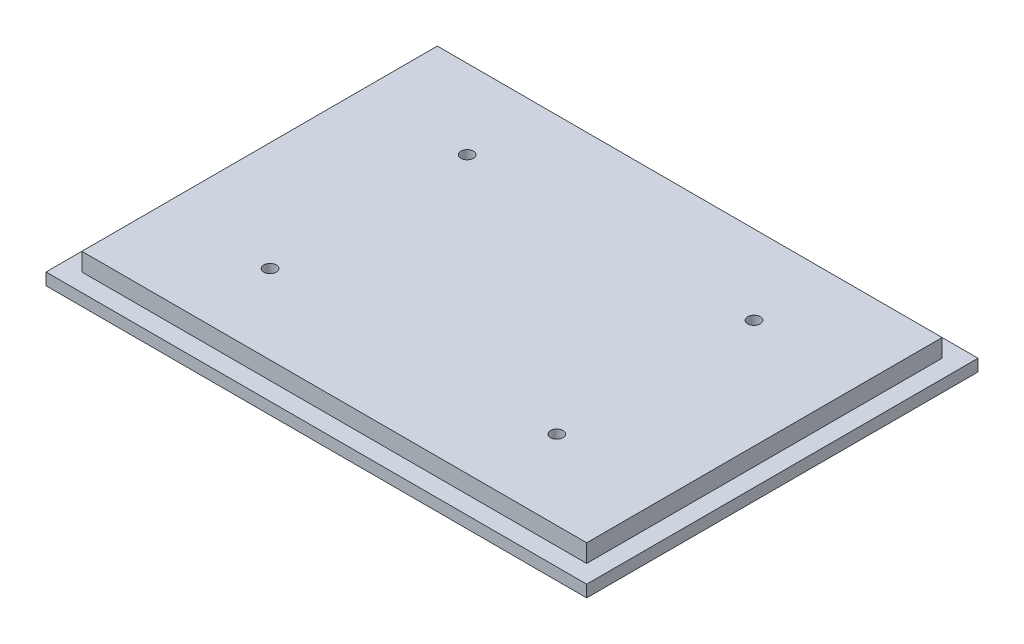
ISO-10303-21;
HEADER;
FILE_DESCRIPTION(('STEP AP214'),'2;1');
FILE_NAME('part.step','',(''),(''),'','','');
FILE_SCHEMA(('AUTOMOTIVE_DESIGN { 1 0 10303 214 1 1 1 1 }'));
ENDSEC;
DATA;
#1=APPLICATION_CONTEXT('core data for automotive mechanical design processes');
#2=APPLICATION_PROTOCOL_DEFINITION('international standard','automotive_design',2000,#1);
#3=PRODUCT_CONTEXT('',#1,'mechanical');
#4=PRODUCT('Part','Part','',(#3));
#5=PRODUCT_RELATED_PRODUCT_CATEGORY('part','',(#4));
#6=PRODUCT_DEFINITION_FORMATION('','',#4);
#7=PRODUCT_DEFINITION_CONTEXT('part definition',#1,'design');
#8=PRODUCT_DEFINITION('design','',#6,#7);
#9=PRODUCT_DEFINITION_SHAPE('','',#8);
#10=(LENGTH_UNIT() NAMED_UNIT(*) SI_UNIT(.MILLI.,.METRE.));
#11=(NAMED_UNIT(*) PLANE_ANGLE_UNIT() SI_UNIT($,.RADIAN.));
#12=(NAMED_UNIT(*) SI_UNIT($,.STERADIAN.) SOLID_ANGLE_UNIT());
#13=UNCERTAINTY_MEASURE_WITH_UNIT(LENGTH_MEASURE(1.E-05),#10,'distance_accuracy_value','');
#14=(GEOMETRIC_REPRESENTATION_CONTEXT(3) GLOBAL_UNCERTAINTY_ASSIGNED_CONTEXT((#13)) GLOBAL_UNIT_ASSIGNED_CONTEXT((#10,
#11,#12)) REPRESENTATION_CONTEXT('',''));
#15=CARTESIAN_POINT('',(0.,0.,0.));
#16=DIRECTION('',(0.,0.,1.));
#17=DIRECTION('',(1.,0.,0.));
#18=AXIS2_PLACEMENT_3D('',#15,#16,#17);
#19=CARTESIAN_POINT('',(84.5,10.,59.5));
#20=DIRECTION('',(-1.,0.,0.));
#21=DIRECTION('',(0.,0.,1.));
#22=AXIS2_PLACEMENT_3D('',#19,#20,#21);
#23=PLANE('',#22);
#24=DIRECTION('',(0.,0.,1.));
#25=VECTOR('',#24,1.);
#26=CARTESIAN_POINT('',(84.5,4.,59.5));
#27=LINE('',#26,#25);
#28=CARTESIAN_POINT('',(84.5,4.,-59.5));
#29=VERTEX_POINT('',#28);
#30=CARTESIAN_POINT('',(84.5,4.,59.5));
#31=VERTEX_POINT('',#30);
#32=EDGE_CURVE('E54',#29,#31,#27,.T.);
#33=ORIENTED_EDGE('',*,*,#32,.F.);
#34=DIRECTION('',(0.,-1.,0.));
#35=VECTOR('',#34,1.);
#36=CARTESIAN_POINT('',(84.5,10.,-59.5));
#37=LINE('',#36,#35);
#38=CARTESIAN_POINT('',(84.5,10.,-59.5));
#39=VERTEX_POINT('',#38);
#40=EDGE_CURVE('E47',#39,#29,#37,.T.);
#41=ORIENTED_EDGE('',*,*,#40,.F.);
#42=DIRECTION('',(0.,0.,-1.));
#43=VECTOR('',#42,1.);
#44=CARTESIAN_POINT('',(84.5,10.,59.5));
#45=LINE('',#44,#43);
#46=CARTESIAN_POINT('',(84.5,10.,59.5));
#47=VERTEX_POINT('',#46);
#48=EDGE_CURVE('E150',#47,#39,#45,.T.);
#49=ORIENTED_EDGE('',*,*,#48,.F.);
#50=DIRECTION('',(0.,-1.,0.));
#51=VECTOR('',#50,1.);
#52=CARTESIAN_POINT('',(84.5,10.,59.5));
#53=LINE('',#52,#51);
#54=EDGE_CURVE('E163',#47,#31,#53,.T.);
#55=ORIENTED_EDGE('',*,*,#54,.T.);
#56=EDGE_LOOP('',(#33,#41,#49,#55));
#57=FACE_BOUND('',#56,.T.);
#58=ADVANCED_FACE('F39',(#57),#23,.F.);
#59=CARTESIAN_POINT('',(-84.5,10.,-59.5));
#60=DIRECTION('',(0.,0.,1.));
#61=DIRECTION('',(1.,0.,0.));
#62=AXIS2_PLACEMENT_3D('',#59,#60,#61);
#63=PLANE('',#62);
#64=DIRECTION('',(1.,0.,0.));
#65=VECTOR('',#64,1.);
#66=CARTESIAN_POINT('',(-84.5,4.,-59.5));
#67=LINE('',#66,#65);
#68=CARTESIAN_POINT('',(-84.5,4.,-59.5));
#69=VERTEX_POINT('',#68);
#70=EDGE_CURVE('E61',#69,#29,#67,.T.);
#71=ORIENTED_EDGE('',*,*,#70,.F.);
#72=DIRECTION('',(0.,-1.,0.));
#73=VECTOR('',#72,1.);
#74=CARTESIAN_POINT('',(-84.5,10.,-59.5));
#75=LINE('',#74,#73);
#76=CARTESIAN_POINT('',(-84.5,10.,-59.5));
#77=VERTEX_POINT('',#76);
#78=EDGE_CURVE('E169',#77,#69,#75,.T.);
#79=ORIENTED_EDGE('',*,*,#78,.F.);
#80=DIRECTION('',(-1.,0.,0.));
#81=VECTOR('',#80,1.);
#82=CARTESIAN_POINT('',(-84.5,10.,-59.5));
#83=LINE('',#82,#81);
#84=EDGE_CURVE('E154',#39,#77,#83,.T.);
#85=ORIENTED_EDGE('',*,*,#84,.F.);
#86=ORIENTED_EDGE('',*,*,#40,.T.);
#87=EDGE_LOOP('',(#71,#79,#85,#86));
#88=FACE_BOUND('',#87,.T.);
#89=ADVANCED_FACE('F172',(#88),#63,.F.);
#90=CARTESIAN_POINT('',(-84.5,10.,59.5));
#91=DIRECTION('',(1.,0.,0.));
#92=DIRECTION('',(0.,0.,-1.));
#93=AXIS2_PLACEMENT_3D('',#90,#91,#92);
#94=PLANE('',#93);
#95=DIRECTION('',(0.,0.,-1.));
#96=VECTOR('',#95,1.);
#97=CARTESIAN_POINT('',(-84.5,4.,59.5));
#98=LINE('',#97,#96);
#99=CARTESIAN_POINT('',(-84.5,4.,59.5));
#100=VERTEX_POINT('',#99);
#101=EDGE_CURVE('E136',#100,#69,#98,.T.);
#102=ORIENTED_EDGE('',*,*,#101,.F.);
#103=DIRECTION('',(0.,-1.,0.));
#104=VECTOR('',#103,1.);
#105=CARTESIAN_POINT('',(-84.5,10.,59.5));
#106=LINE('',#105,#104);
#107=CARTESIAN_POINT('',(-84.5,10.,59.5));
#108=VERTEX_POINT('',#107);
#109=EDGE_CURVE('E166',#108,#100,#106,.T.);
#110=ORIENTED_EDGE('',*,*,#109,.F.);
#111=DIRECTION('',(0.,0.,1.));
#112=VECTOR('',#111,1.);
#113=CARTESIAN_POINT('',(-84.5,10.,59.5));
#114=LINE('',#113,#112);
#115=EDGE_CURVE('E157',#77,#108,#114,.T.);
#116=ORIENTED_EDGE('',*,*,#115,.F.);
#117=ORIENTED_EDGE('',*,*,#78,.T.);
#118=EDGE_LOOP('',(#102,#110,#116,#117));
#119=FACE_BOUND('',#118,.T.);
#120=ADVANCED_FACE('F177',(#119),#94,.F.);
#121=CARTESIAN_POINT('',(-84.5,10.,59.5));
#122=DIRECTION('',(0.,0.,-1.));
#123=DIRECTION('',(-1.,0.,0.));
#124=AXIS2_PLACEMENT_3D('',#121,#122,#123);
#125=PLANE('',#124);
#126=DIRECTION('',(-1.,0.,0.));
#127=VECTOR('',#126,1.);
#128=CARTESIAN_POINT('',(-84.5,4.,59.5));
#129=LINE('',#128,#127);
#130=EDGE_CURVE('E11',#31,#100,#129,.T.);
#131=ORIENTED_EDGE('',*,*,#130,.F.);
#132=ORIENTED_EDGE('',*,*,#54,.F.);
#133=DIRECTION('',(1.,0.,0.));
#134=VECTOR('',#133,1.);
#135=CARTESIAN_POINT('',(-84.5,10.,59.5));
#136=LINE('',#135,#134);
#137=EDGE_CURVE('E160',#108,#47,#136,.T.);
#138=ORIENTED_EDGE('',*,*,#137,.F.);
#139=ORIENTED_EDGE('',*,*,#109,.T.);
#140=EDGE_LOOP('',(#131,#132,#138,#139));
#141=FACE_BOUND('',#140,.T.);
#142=ADVANCED_FACE('F184',(#141),#125,.F.);
#143=CARTESIAN_POINT('',(0.,10.,0.));
#144=DIRECTION('',(0.,-1.,0.));
#145=DIRECTION('',(0.,0.,-1.));
#146=AXIS2_PLACEMENT_3D('',#143,#144,#145);
#147=PLANE('',#146);
#148=CARTESIAN_POINT('',(-48.,10.,33.));
#149=DIRECTION('',(0.,1.,0.));
#150=DIRECTION('',(0.,0.,1.));
#151=AXIS2_PLACEMENT_3D('',#148,#149,#150);
#152=CIRCLE('',#151,2.1);
#153=CARTESIAN_POINT('',(-48.,10.,35.1));
#154=VERTEX_POINT('',#153);
#155=EDGE_CURVE('E320',#154,#154,#152,.T.);
#156=ORIENTED_EDGE('',*,*,#155,.F.);
#157=EDGE_LOOP('',(#156));
#158=FACE_BOUND('',#157,.T.);
#159=CARTESIAN_POINT('',(48.,10.,33.));
#160=DIRECTION('',(0.,1.,0.));
#161=DIRECTION('',(0.,0.,1.));
#162=AXIS2_PLACEMENT_3D('',#159,#160,#161);
#163=CIRCLE('',#162,2.1);
#164=CARTESIAN_POINT('',(48.,10.,35.1));
#165=VERTEX_POINT('',#164);
#166=EDGE_CURVE('E324',#165,#165,#163,.T.);
#167=ORIENTED_EDGE('',*,*,#166,.F.);
#168=EDGE_LOOP('',(#167));
#169=FACE_BOUND('',#168,.T.);
#170=CARTESIAN_POINT('',(48.,10.,-33.));
#171=DIRECTION('',(0.,1.,0.));
#172=DIRECTION('',(0.,0.,1.));
#173=AXIS2_PLACEMENT_3D('',#170,#171,#172);
#174=CIRCLE('',#173,2.1);
#175=CARTESIAN_POINT('',(48.,10.,-30.9));
#176=VERTEX_POINT('',#175);
#177=EDGE_CURVE('E362',#176,#176,#174,.T.);
#178=ORIENTED_EDGE('',*,*,#177,.F.);
#179=EDGE_LOOP('',(#178));
#180=FACE_BOUND('',#179,.T.);
#181=CARTESIAN_POINT('',(-48.,10.,-33.));
#182=DIRECTION('',(0.,1.,0.));
#183=DIRECTION('',(0.,0.,1.));
#184=AXIS2_PLACEMENT_3D('',#181,#182,#183);
#185=CIRCLE('',#184,2.1);
#186=CARTESIAN_POINT('',(-48.,10.,-30.9));
#187=VERTEX_POINT('',#186);
#188=EDGE_CURVE('E332',#187,#187,#185,.T.);
#189=ORIENTED_EDGE('',*,*,#188,.F.);
#190=EDGE_LOOP('',(#189));
#191=FACE_BOUND('',#190,.T.);
#192=ORIENTED_EDGE('',*,*,#48,.T.);
#193=ORIENTED_EDGE('',*,*,#84,.T.);
#194=ORIENTED_EDGE('',*,*,#115,.T.);
#195=ORIENTED_EDGE('',*,*,#137,.T.);
#196=EDGE_LOOP('',(#192,#193,#194,#195));
#197=FACE_BOUND('',#196,.T.);
#198=ADVANCED_FACE('F181',(#158,#169,#180,#191,#197),#147,.F.);
#199=CARTESIAN_POINT('',(0.,4.,0.));
#200=DIRECTION('',(0.,-1.,0.));
#201=DIRECTION('',(0.,0.,-1.));
#202=AXIS2_PLACEMENT_3D('',#199,#200,#201);
#203=PLANE('',#202);
#204=DIRECTION('',(0.,0.,-1.));
#205=VECTOR('',#204,1.);
#206=CARTESIAN_POINT('',(90.5,4.,65.5));
#207=LINE('',#206,#205);
#208=CARTESIAN_POINT('',(90.5,4.,65.5));
#209=VERTEX_POINT('',#208);
#210=CARTESIAN_POINT('',(90.5,4.,-65.5));
#211=VERTEX_POINT('',#210);
#212=EDGE_CURVE('E119',#209,#211,#207,.T.);
#213=ORIENTED_EDGE('',*,*,#212,.T.);
#214=DIRECTION('',(-1.,0.,0.));
#215=VECTOR('',#214,1.);
#216=CARTESIAN_POINT('',(-90.5,4.,-65.5));
#217=LINE('',#216,#215);
#218=CARTESIAN_POINT('',(-90.5,4.,-65.5));
#219=VERTEX_POINT('',#218);
#220=EDGE_CURVE('E107',#211,#219,#217,.T.);
#221=ORIENTED_EDGE('',*,*,#220,.T.);
#222=DIRECTION('',(0.,0.,1.));
#223=VECTOR('',#222,1.);
#224=CARTESIAN_POINT('',(-90.5,4.,65.5));
#225=LINE('',#224,#223);
#226=CARTESIAN_POINT('',(-90.5,4.,65.5));
#227=VERTEX_POINT('',#226);
#228=EDGE_CURVE('E118',#219,#227,#225,.T.);
#229=ORIENTED_EDGE('',*,*,#228,.T.);
#230=DIRECTION('',(1.,0.,0.));
#231=VECTOR('',#230,1.);
#232=CARTESIAN_POINT('',(-90.5,4.,65.5));
#233=LINE('',#232,#231);
#234=EDGE_CURVE('E125',#227,#209,#233,.T.);
#235=ORIENTED_EDGE('',*,*,#234,.T.);
#236=EDGE_LOOP('',(#213,#221,#229,#235));
#237=FACE_BOUND('',#236,.T.);
#238=ORIENTED_EDGE('',*,*,#70,.T.);
#239=ORIENTED_EDGE('',*,*,#32,.T.);
#240=ORIENTED_EDGE('',*,*,#130,.T.);
#241=ORIENTED_EDGE('',*,*,#101,.T.);
#242=EDGE_LOOP('',(#238,#239,#240,#241));
#243=FACE_BOUND('',#242,.T.);
#244=ADVANCED_FACE('F122',(#237,#243),#203,.F.);
#245=CARTESIAN_POINT('',(90.5,4.,65.5));
#246=DIRECTION('',(-1.,0.,0.));
#247=DIRECTION('',(0.,0.,1.));
#248=AXIS2_PLACEMENT_3D('',#245,#246,#247);
#249=PLANE('',#248);
#250=DIRECTION('',(0.,0.,-1.));
#251=VECTOR('',#250,1.);
#252=CARTESIAN_POINT('',(90.5,0.,65.5));
#253=LINE('',#252,#251);
#254=CARTESIAN_POINT('',(90.5,0.,65.5));
#255=VERTEX_POINT('',#254);
#256=CARTESIAN_POINT('',(90.5,0.,-65.5));
#257=VERTEX_POINT('',#256);
#258=EDGE_CURVE('E134',#255,#257,#253,.T.);
#259=ORIENTED_EDGE('',*,*,#258,.T.);
#260=DIRECTION('',(0.,-1.,0.));
#261=VECTOR('',#260,1.);
#262=CARTESIAN_POINT('',(90.5,4.,-65.5));
#263=LINE('',#262,#261);
#264=EDGE_CURVE('E111',#211,#257,#263,.T.);
#265=ORIENTED_EDGE('',*,*,#264,.F.);
#266=ORIENTED_EDGE('',*,*,#212,.F.);
#267=DIRECTION('',(0.,-1.,0.));
#268=VECTOR('',#267,1.);
#269=CARTESIAN_POINT('',(90.5,4.,65.5));
#270=LINE('',#269,#268);
#271=EDGE_CURVE('E341',#209,#255,#270,.T.);
#272=ORIENTED_EDGE('',*,*,#271,.T.);
#273=EDGE_LOOP('',(#259,#265,#266,#272));
#274=FACE_BOUND('',#273,.T.);
#275=ADVANCED_FACE('F132',(#274),#249,.F.);
#276=CARTESIAN_POINT('',(-90.5,4.,-65.5));
#277=DIRECTION('',(0.,0.,1.));
#278=DIRECTION('',(1.,0.,0.));
#279=AXIS2_PLACEMENT_3D('',#276,#277,#278);
#280=PLANE('',#279);
#281=DIRECTION('',(-1.,0.,0.));
#282=VECTOR('',#281,1.);
#283=CARTESIAN_POINT('',(-90.5,0.,-65.5));
#284=LINE('',#283,#282);
#285=CARTESIAN_POINT('',(-90.5,0.,-65.5));
#286=VERTEX_POINT('',#285);
#287=EDGE_CURVE('E344',#257,#286,#284,.T.);
#288=ORIENTED_EDGE('',*,*,#287,.T.);
#289=DIRECTION('',(0.,-1.,0.));
#290=VECTOR('',#289,1.);
#291=CARTESIAN_POINT('',(-90.5,4.,-65.5));
#292=LINE('',#291,#290);
#293=EDGE_CURVE('E114',#219,#286,#292,.T.);
#294=ORIENTED_EDGE('',*,*,#293,.F.);
#295=ORIENTED_EDGE('',*,*,#220,.F.);
#296=ORIENTED_EDGE('',*,*,#264,.T.);
#297=EDGE_LOOP('',(#288,#294,#295,#296));
#298=FACE_BOUND('',#297,.T.);
#299=ADVANCED_FACE('F109',(#298),#280,.F.);
#300=CARTESIAN_POINT('',(-90.5,4.,65.5));
#301=DIRECTION('',(1.,0.,0.));
#302=DIRECTION('',(0.,0.,-1.));
#303=AXIS2_PLACEMENT_3D('',#300,#301,#302);
#304=PLANE('',#303);
#305=DIRECTION('',(0.,0.,1.));
#306=VECTOR('',#305,1.);
#307=CARTESIAN_POINT('',(-90.5,0.,65.5));
#308=LINE('',#307,#306);
#309=CARTESIAN_POINT('',(-90.5,0.,65.5));
#310=VERTEX_POINT('',#309);
#311=EDGE_CURVE('E347',#286,#310,#308,.T.);
#312=ORIENTED_EDGE('',*,*,#311,.T.);
#313=DIRECTION('',(0.,-1.,0.));
#314=VECTOR('',#313,1.);
#315=CARTESIAN_POINT('',(-90.5,4.,65.5));
#316=LINE('',#315,#314);
#317=EDGE_CURVE('E142',#227,#310,#316,.T.);
#318=ORIENTED_EDGE('',*,*,#317,.F.);
#319=ORIENTED_EDGE('',*,*,#228,.F.);
#320=ORIENTED_EDGE('',*,*,#293,.T.);
#321=EDGE_LOOP('',(#312,#318,#319,#320));
#322=FACE_BOUND('',#321,.T.);
#323=ADVANCED_FACE('F236',(#322),#304,.F.);
#324=CARTESIAN_POINT('',(-90.5,4.,65.5));
#325=DIRECTION('',(0.,0.,-1.));
#326=DIRECTION('',(-1.,0.,0.));
#327=AXIS2_PLACEMENT_3D('',#324,#325,#326);
#328=PLANE('',#327);
#329=DIRECTION('',(1.,0.,0.));
#330=VECTOR('',#329,1.);
#331=CARTESIAN_POINT('',(-90.5,0.,65.5));
#332=LINE('',#331,#330);
#333=EDGE_CURVE('E130',#310,#255,#332,.T.);
#334=ORIENTED_EDGE('',*,*,#333,.T.);
#335=ORIENTED_EDGE('',*,*,#271,.F.);
#336=ORIENTED_EDGE('',*,*,#234,.F.);
#337=ORIENTED_EDGE('',*,*,#317,.T.);
#338=EDGE_LOOP('',(#334,#335,#336,#337));
#339=FACE_BOUND('',#338,.T.);
#340=ADVANCED_FACE('F245',(#339),#328,.F.);
#341=CARTESIAN_POINT('',(0.,0.,0.));
#342=DIRECTION('',(0.,-1.,0.));
#343=DIRECTION('',(0.,0.,-1.));
#344=AXIS2_PLACEMENT_3D('',#341,#342,#343);
#345=PLANE('',#344);
#346=CARTESIAN_POINT('',(-48.,0.,33.));
#347=DIRECTION('',(0.,1.,0.));
#348=DIRECTION('',(0.,0.,1.));
#349=AXIS2_PLACEMENT_3D('',#346,#347,#348);
#350=CIRCLE('',#349,2.1);
#351=CARTESIAN_POINT('',(-48.,0.,35.1));
#352=VERTEX_POINT('',#351);
#353=EDGE_CURVE('E317',#352,#352,#350,.T.);
#354=ORIENTED_EDGE('',*,*,#353,.T.);
#355=EDGE_LOOP('',(#354));
#356=FACE_BOUND('',#355,.T.);
#357=CARTESIAN_POINT('',(48.,0.,33.));
#358=DIRECTION('',(0.,1.,0.));
#359=DIRECTION('',(0.,0.,1.));
#360=AXIS2_PLACEMENT_3D('',#357,#358,#359);
#361=CIRCLE('',#360,2.1);
#362=CARTESIAN_POINT('',(48.,0.,35.1));
#363=VERTEX_POINT('',#362);
#364=EDGE_CURVE('E366',#363,#363,#361,.T.);
#365=ORIENTED_EDGE('',*,*,#364,.T.);
#366=EDGE_LOOP('',(#365));
#367=FACE_BOUND('',#366,.T.);
#368=CARTESIAN_POINT('',(48.,0.,-33.));
#369=DIRECTION('',(0.,1.,0.));
#370=DIRECTION('',(0.,0.,1.));
#371=AXIS2_PLACEMENT_3D('',#368,#369,#370);
#372=CIRCLE('',#371,2.1);
#373=CARTESIAN_POINT('',(48.,0.,-30.9));
#374=VERTEX_POINT('',#373);
#375=EDGE_CURVE('E335',#374,#374,#372,.T.);
#376=ORIENTED_EDGE('',*,*,#375,.T.);
#377=EDGE_LOOP('',(#376));
#378=FACE_BOUND('',#377,.T.);
#379=CARTESIAN_POINT('',(-48.,0.,-33.));
#380=DIRECTION('',(0.,1.,0.));
#381=DIRECTION('',(0.,0.,1.));
#382=AXIS2_PLACEMENT_3D('',#379,#380,#381);
#383=CIRCLE('',#382,2.1);
#384=CARTESIAN_POINT('',(-48.,0.,-30.9));
#385=VERTEX_POINT('',#384);
#386=EDGE_CURVE('E328',#385,#385,#383,.T.);
#387=ORIENTED_EDGE('',*,*,#386,.T.);
#388=EDGE_LOOP('',(#387));
#389=FACE_BOUND('',#388,.T.);
#390=ORIENTED_EDGE('',*,*,#258,.F.);
#391=ORIENTED_EDGE('',*,*,#333,.F.);
#392=ORIENTED_EDGE('',*,*,#311,.F.);
#393=ORIENTED_EDGE('',*,*,#287,.F.);
#394=EDGE_LOOP('',(#390,#391,#392,#393));
#395=FACE_BOUND('',#394,.T.);
#396=ADVANCED_FACE('F255',(#356,#367,#378,#389,#395),#345,.T.);
#397=CARTESIAN_POINT('',(-48.,0.,-33.));
#398=DIRECTION('',(0.,1.,0.));
#399=DIRECTION('',(0.,0.,1.));
#400=AXIS2_PLACEMENT_3D('',#397,#398,#399);
#401=CYLINDRICAL_SURFACE('',#400,2.1);
#402=ORIENTED_EDGE('',*,*,#386,.F.);
#403=EDGE_LOOP('',(#402));
#404=FACE_BOUND('',#403,.T.);
#405=ORIENTED_EDGE('',*,*,#188,.T.);
#406=EDGE_LOOP('',(#405));
#407=FACE_BOUND('',#406,.T.);
#408=ADVANCED_FACE('F271',(#404,#407),#401,.F.);
#409=CARTESIAN_POINT('',(48.,0.,-33.));
#410=DIRECTION('',(0.,1.,0.));
#411=DIRECTION('',(0.,0.,1.));
#412=AXIS2_PLACEMENT_3D('',#409,#410,#411);
#413=CYLINDRICAL_SURFACE('',#412,2.1);
#414=ORIENTED_EDGE('',*,*,#375,.F.);
#415=EDGE_LOOP('',(#414));
#416=FACE_BOUND('',#415,.T.);
#417=ORIENTED_EDGE('',*,*,#177,.T.);
#418=EDGE_LOOP('',(#417));
#419=FACE_BOUND('',#418,.T.);
#420=ADVANCED_FACE('F280',(#416,#419),#413,.F.);
#421=CARTESIAN_POINT('',(48.,0.,33.));
#422=DIRECTION('',(0.,1.,0.));
#423=DIRECTION('',(0.,0.,1.));
#424=AXIS2_PLACEMENT_3D('',#421,#422,#423);
#425=CYLINDRICAL_SURFACE('',#424,2.1);
#426=ORIENTED_EDGE('',*,*,#364,.F.);
#427=EDGE_LOOP('',(#426));
#428=FACE_BOUND('',#427,.T.);
#429=ORIENTED_EDGE('',*,*,#166,.T.);
#430=EDGE_LOOP('',(#429));
#431=FACE_BOUND('',#430,.T.);
#432=ADVANCED_FACE('F290',(#428,#431),#425,.F.);
#433=CARTESIAN_POINT('',(-48.,0.,33.));
#434=DIRECTION('',(0.,1.,0.));
#435=DIRECTION('',(0.,0.,1.));
#436=AXIS2_PLACEMENT_3D('',#433,#434,#435);
#437=CYLINDRICAL_SURFACE('',#436,2.1);
#438=ORIENTED_EDGE('',*,*,#353,.F.);
#439=EDGE_LOOP('',(#438));
#440=FACE_BOUND('',#439,.T.);
#441=ORIENTED_EDGE('',*,*,#155,.T.);
#442=EDGE_LOOP('',(#441));
#443=FACE_BOUND('',#442,.T.);
#444=ADVANCED_FACE('F300',(#440,#443),#437,.F.);
#445=CLOSED_SHELL('',(#58,#89,#120,#142,#198,#244,#275,#299,#323,#340,#396,#408,#420,#432,#444));
#446=MANIFOLD_SOLID_BREP('B2',#445);
#447=ADVANCED_BREP_SHAPE_REPRESENTATION('',(#18,#446),#14);
#448=SHAPE_DEFINITION_REPRESENTATION(#9,#447);
ENDSEC;
END-ISO-10303-21;
